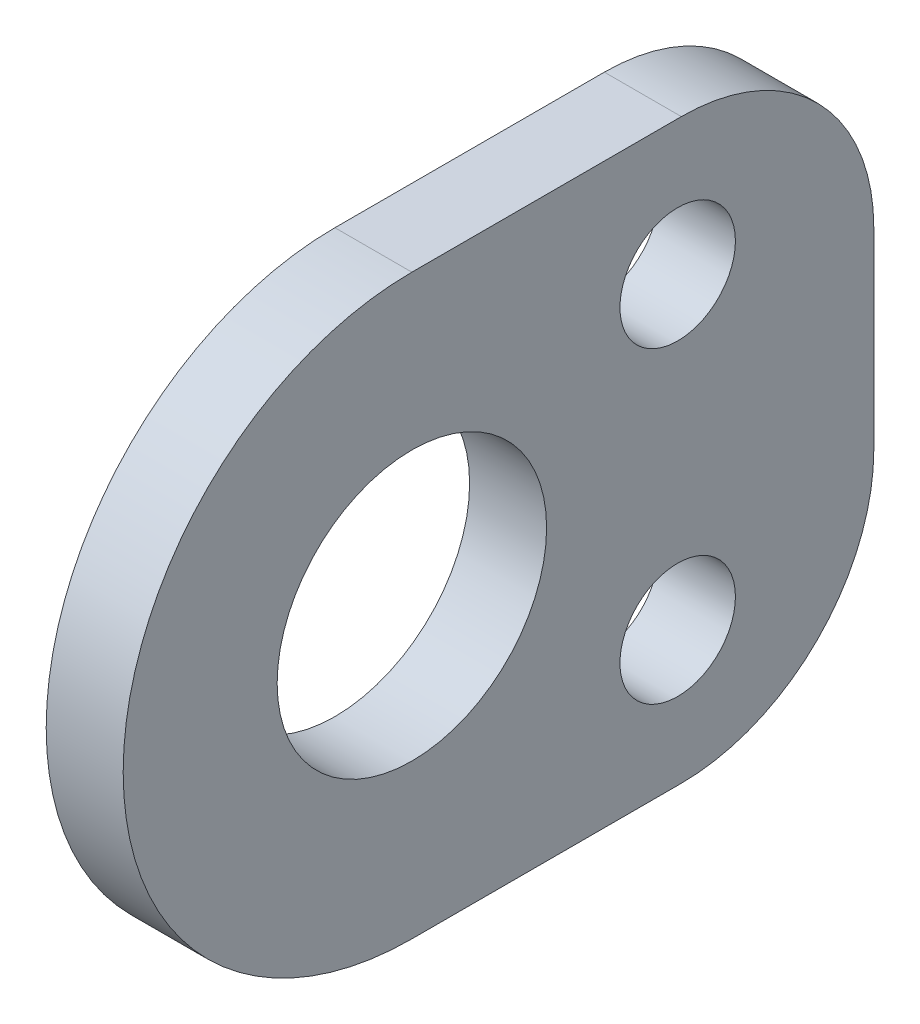
ISO-10303-21;
HEADER;
FILE_DESCRIPTION(('STEP AP214'),'2;1');
FILE_NAME('part.step','',(''),(''),'','','');
FILE_SCHEMA(('AUTOMOTIVE_DESIGN { 1 0 10303 214 1 1 1 1 }'));
ENDSEC;
DATA;
#1=APPLICATION_CONTEXT('core data for automotive mechanical design processes');
#2=APPLICATION_PROTOCOL_DEFINITION('international standard','automotive_design',2000,#1);
#3=PRODUCT_CONTEXT('',#1,'mechanical');
#4=PRODUCT('Part','Part','',(#3));
#5=PRODUCT_RELATED_PRODUCT_CATEGORY('part','',(#4));
#6=PRODUCT_DEFINITION_FORMATION('','',#4);
#7=PRODUCT_DEFINITION_CONTEXT('part definition',#1,'design');
#8=PRODUCT_DEFINITION('design','',#6,#7);
#9=PRODUCT_DEFINITION_SHAPE('','',#8);
#10=(LENGTH_UNIT() NAMED_UNIT(*) SI_UNIT(.MILLI.,.METRE.));
#11=(NAMED_UNIT(*) PLANE_ANGLE_UNIT() SI_UNIT($,.RADIAN.));
#12=(NAMED_UNIT(*) SI_UNIT($,.STERADIAN.) SOLID_ANGLE_UNIT());
#13=UNCERTAINTY_MEASURE_WITH_UNIT(LENGTH_MEASURE(1.E-05),#10,'distance_accuracy_value','');
#14=(GEOMETRIC_REPRESENTATION_CONTEXT(3) GLOBAL_UNCERTAINTY_ASSIGNED_CONTEXT((#13)) GLOBAL_UNIT_ASSIGNED_CONTEXT((#10,
#11,#12)) REPRESENTATION_CONTEXT('',''));
#15=CARTESIAN_POINT('',(0.,0.,0.));
#16=DIRECTION('',(0.,0.,1.));
#17=DIRECTION('',(1.,0.,0.));
#18=AXIS2_PLACEMENT_3D('',#15,#16,#17);
#19=CARTESIAN_POINT('',(2.,7.5,0.));
#20=DIRECTION('',(0.,1.,0.));
#21=DIRECTION('',(0.,0.,1.));
#22=AXIS2_PLACEMENT_3D('',#19,#20,#21);
#23=PLANE('',#22);
#24=DIRECTION('',(0.,0.,-1.));
#25=VECTOR('',#24,1.);
#26=CARTESIAN_POINT('',(2.,7.5,0.));
#27=LINE('',#26,#25);
#28=CARTESIAN_POINT('',(2.,7.5,0.));
#29=VERTEX_POINT('',#28);
#30=CARTESIAN_POINT('',(2.,7.5,-7.));
#31=VERTEX_POINT('',#30);
#32=EDGE_CURVE('E107',#29,#31,#27,.T.);
#33=ORIENTED_EDGE('',*,*,#32,.T.);
#34=DIRECTION('',(-1.,0.,0.));
#35=VECTOR('',#34,1.);
#36=CARTESIAN_POINT('',(2.,7.5,-7.));
#37=LINE('',#36,#35);
#38=CARTESIAN_POINT('',(0.,7.5,-7.));
#39=VERTEX_POINT('',#38);
#40=EDGE_CURVE('E11',#31,#39,#37,.T.);
#41=ORIENTED_EDGE('',*,*,#40,.T.);
#42=DIRECTION('',(0.,0.,-1.));
#43=VECTOR('',#42,1.);
#44=CARTESIAN_POINT('',(0.,7.5,0.));
#45=LINE('',#44,#43);
#46=CARTESIAN_POINT('',(0.,7.5,0.));
#47=VERTEX_POINT('',#46);
#48=EDGE_CURVE('E110',#47,#39,#45,.T.);
#49=ORIENTED_EDGE('',*,*,#48,.F.);
#50=DIRECTION('',(-1.,0.,0.));
#51=VECTOR('',#50,1.);
#52=CARTESIAN_POINT('',(2.,7.5,0.));
#53=LINE('',#52,#51);
#54=EDGE_CURVE('E105',#29,#47,#53,.T.);
#55=ORIENTED_EDGE('',*,*,#54,.F.);
#56=EDGE_LOOP('',(#33,#41,#49,#55));
#57=FACE_BOUND('',#56,.T.);
#58=ADVANCED_FACE('F49',(#57),#23,.T.);
#59=CARTESIAN_POINT('',(2.,0.,0.));
#60=DIRECTION('',(-1.,0.,0.));
#61=DIRECTION('',(0.,0.,1.));
#62=AXIS2_PLACEMENT_3D('',#59,#60,#61);
#63=CYLINDRICAL_SURFACE('',#62,7.5);
#64=CARTESIAN_POINT('',(0.,0.,0.));
#65=DIRECTION('',(1.,0.,0.));
#66=DIRECTION('',(0.,0.,-1.));
#67=AXIS2_PLACEMENT_3D('',#64,#65,#66);
#68=CIRCLE('',#67,7.5);
#69=CARTESIAN_POINT('',(0.,-7.5,0.));
#70=VERTEX_POINT('',#69);
#71=EDGE_CURVE('E156',#47,#70,#68,.T.);
#72=ORIENTED_EDGE('',*,*,#71,.T.);
#73=DIRECTION('',(-1.,0.,0.));
#74=VECTOR('',#73,1.);
#75=CARTESIAN_POINT('',(2.,-7.5,0.));
#76=LINE('',#75,#74);
#77=CARTESIAN_POINT('',(2.,-7.5,0.));
#78=VERTEX_POINT('',#77);
#79=EDGE_CURVE('E116',#78,#70,#76,.T.);
#80=ORIENTED_EDGE('',*,*,#79,.F.);
#81=CARTESIAN_POINT('',(2.,0.,0.));
#82=DIRECTION('',(1.,0.,0.));
#83=DIRECTION('',(0.,0.,-1.));
#84=AXIS2_PLACEMENT_3D('',#81,#82,#83);
#85=CIRCLE('',#84,7.5);
#86=EDGE_CURVE('E120',#29,#78,#85,.T.);
#87=ORIENTED_EDGE('',*,*,#86,.F.);
#88=ORIENTED_EDGE('',*,*,#54,.T.);
#89=EDGE_LOOP('',(#72,#80,#87,#88));
#90=FACE_BOUND('',#89,.T.);
#91=ADVANCED_FACE('F121',(#90),#63,.T.);
#92=CARTESIAN_POINT('',(2.,-7.5,0.));
#93=DIRECTION('',(0.,-1.,0.));
#94=DIRECTION('',(0.,0.,-1.));
#95=AXIS2_PLACEMENT_3D('',#92,#93,#94);
#96=PLANE('',#95);
#97=DIRECTION('',(0.,0.,1.));
#98=VECTOR('',#97,1.);
#99=CARTESIAN_POINT('',(0.,-7.5,0.));
#100=LINE('',#99,#98);
#101=CARTESIAN_POINT('',(0.,-7.5,-7.));
#102=VERTEX_POINT('',#101);
#103=EDGE_CURVE('E159',#102,#70,#100,.T.);
#104=ORIENTED_EDGE('',*,*,#103,.F.);
#105=DIRECTION('',(-1.,0.,0.));
#106=VECTOR('',#105,1.);
#107=CARTESIAN_POINT('',(2.,-7.5,-7.));
#108=LINE('',#107,#106);
#109=CARTESIAN_POINT('',(2.,-7.5,-7.));
#110=VERTEX_POINT('',#109);
#111=EDGE_CURVE('E73',#102,#110,#108,.F.);
#112=ORIENTED_EDGE('',*,*,#111,.T.);
#113=DIRECTION('',(0.,0.,1.));
#114=VECTOR('',#113,1.);
#115=CARTESIAN_POINT('',(2.,-7.5,0.));
#116=LINE('',#115,#114);
#117=EDGE_CURVE('E124',#110,#78,#116,.T.);
#118=ORIENTED_EDGE('',*,*,#117,.T.);
#119=ORIENTED_EDGE('',*,*,#79,.T.);
#120=EDGE_LOOP('',(#104,#112,#118,#119));
#121=FACE_BOUND('',#120,.T.);
#122=ADVANCED_FACE('F195',(#121),#96,.T.);
#123=CARTESIAN_POINT('',(2.,0.,0.));
#124=DIRECTION('',(-1.,0.,0.));
#125=DIRECTION('',(0.,0.,1.));
#126=AXIS2_PLACEMENT_3D('',#123,#124,#125);
#127=CYLINDRICAL_SURFACE('',#126,3.5);
#128=CARTESIAN_POINT('',(2.,0.,0.));
#129=DIRECTION('',(1.,0.,0.));
#130=DIRECTION('',(0.,0.,-1.));
#131=AXIS2_PLACEMENT_3D('',#128,#129,#130);
#132=CIRCLE('',#131,3.5);
#133=CARTESIAN_POINT('',(2.,0.,-3.5));
#134=VERTEX_POINT('',#133);
#135=EDGE_CURVE('E128',#134,#134,#132,.T.);
#136=ORIENTED_EDGE('',*,*,#135,.T.);
#137=EDGE_LOOP('',(#136));
#138=FACE_BOUND('',#137,.T.);
#139=CARTESIAN_POINT('',(0.,0.,0.));
#140=DIRECTION('',(1.,0.,0.));
#141=DIRECTION('',(0.,0.,-1.));
#142=AXIS2_PLACEMENT_3D('',#139,#140,#141);
#143=CIRCLE('',#142,3.5);
#144=CARTESIAN_POINT('',(0.,0.,-3.5));
#145=VERTEX_POINT('',#144);
#146=EDGE_CURVE('E150',#145,#145,#143,.T.);
#147=ORIENTED_EDGE('',*,*,#146,.F.);
#148=EDGE_LOOP('',(#147));
#149=FACE_BOUND('',#148,.T.);
#150=ADVANCED_FACE('F211',(#138,#149),#127,.F.);
#151=CARTESIAN_POINT('',(2.,4.,-6.9050995648144));
#152=DIRECTION('',(-1.,0.,0.));
#153=DIRECTION('',(0.,0.,1.));
#154=AXIS2_PLACEMENT_3D('',#151,#152,#153);
#155=CYLINDRICAL_SURFACE('',#154,1.5);
#156=CARTESIAN_POINT('',(2.,4.,-6.9050995648144));
#157=DIRECTION('',(1.,0.,0.));
#158=DIRECTION('',(0.,0.,-1.));
#159=AXIS2_PLACEMENT_3D('',#156,#157,#158);
#160=CIRCLE('',#159,1.5);
#161=CARTESIAN_POINT('',(2.,4.,-8.4050995648144));
#162=VERTEX_POINT('',#161);
#163=EDGE_CURVE('E132',#162,#162,#160,.T.);
#164=ORIENTED_EDGE('',*,*,#163,.T.);
#165=EDGE_LOOP('',(#164));
#166=FACE_BOUND('',#165,.T.);
#167=CARTESIAN_POINT('',(0.,4.,-6.9050995648144));
#168=DIRECTION('',(1.,0.,0.));
#169=DIRECTION('',(0.,0.,-1.));
#170=AXIS2_PLACEMENT_3D('',#167,#168,#169);
#171=CIRCLE('',#170,1.5);
#172=CARTESIAN_POINT('',(0.,4.,-8.4050995648144));
#173=VERTEX_POINT('',#172);
#174=EDGE_CURVE('E146',#173,#173,#171,.T.);
#175=ORIENTED_EDGE('',*,*,#174,.F.);
#176=EDGE_LOOP('',(#175));
#177=FACE_BOUND('',#176,.T.);
#178=ADVANCED_FACE('F214',(#166,#177),#155,.F.);
#179=CARTESIAN_POINT('',(2.,-4.,-6.9050995648144));
#180=DIRECTION('',(-1.,0.,0.));
#181=DIRECTION('',(0.,0.,1.));
#182=AXIS2_PLACEMENT_3D('',#179,#180,#181);
#183=CYLINDRICAL_SURFACE('',#182,1.5);
#184=CARTESIAN_POINT('',(2.,-4.,-6.9050995648144));
#185=DIRECTION('',(1.,0.,0.));
#186=DIRECTION('',(0.,0.,-1.));
#187=AXIS2_PLACEMENT_3D('',#184,#185,#186);
#188=CIRCLE('',#187,1.5);
#189=CARTESIAN_POINT('',(2.,-4.,-8.4050995648144));
#190=VERTEX_POINT('',#189);
#191=EDGE_CURVE('E166',#190,#190,#188,.T.);
#192=ORIENTED_EDGE('',*,*,#191,.T.);
#193=EDGE_LOOP('',(#192));
#194=FACE_BOUND('',#193,.T.);
#195=CARTESIAN_POINT('',(0.,-4.,-6.9050995648144));
#196=DIRECTION('',(1.,0.,0.));
#197=DIRECTION('',(0.,0.,-1.));
#198=AXIS2_PLACEMENT_3D('',#195,#196,#197);
#199=CIRCLE('',#198,1.5);
#200=CARTESIAN_POINT('',(0.,-4.,-8.4050995648144));
#201=VERTEX_POINT('',#200);
#202=EDGE_CURVE('E142',#201,#201,#199,.T.);
#203=ORIENTED_EDGE('',*,*,#202,.F.);
#204=EDGE_LOOP('',(#203));
#205=FACE_BOUND('',#204,.T.);
#206=ADVANCED_FACE('F218',(#194,#205),#183,.F.);
#207=CARTESIAN_POINT('',(2.,0.,-12.));
#208=DIRECTION('',(0.,0.,-1.));
#209=DIRECTION('',(-1.,0.,0.));
#210=AXIS2_PLACEMENT_3D('',#207,#208,#209);
#211=PLANE('',#210);
#212=DIRECTION('',(0.,-1.,0.));
#213=VECTOR('',#212,1.);
#214=CARTESIAN_POINT('',(2.,0.,-12.));
#215=LINE('',#214,#213);
#216=CARTESIAN_POINT('',(2.,2.5,-12.));
#217=VERTEX_POINT('',#216);
#218=CARTESIAN_POINT('',(2.,-2.5,-12.));
#219=VERTEX_POINT('',#218);
#220=EDGE_CURVE('E138',#217,#219,#215,.T.);
#221=ORIENTED_EDGE('',*,*,#220,.T.);
#222=DIRECTION('',(-1.,0.,0.));
#223=VECTOR('',#222,1.);
#224=CARTESIAN_POINT('',(2.,-2.5,-12.));
#225=LINE('',#224,#223);
#226=CARTESIAN_POINT('',(0.,-2.5,-12.));
#227=VERTEX_POINT('',#226);
#228=EDGE_CURVE('E171',#219,#227,#225,.T.);
#229=ORIENTED_EDGE('',*,*,#228,.T.);
#230=DIRECTION('',(0.,-1.,0.));
#231=VECTOR('',#230,1.);
#232=CARTESIAN_POINT('',(0.,0.,-12.));
#233=LINE('',#232,#231);
#234=CARTESIAN_POINT('',(0.,2.5,-12.));
#235=VERTEX_POINT('',#234);
#236=EDGE_CURVE('E162',#235,#227,#233,.T.);
#237=ORIENTED_EDGE('',*,*,#236,.F.);
#238=DIRECTION('',(-1.,0.,0.));
#239=VECTOR('',#238,1.);
#240=CARTESIAN_POINT('',(2.,2.5,-12.));
#241=LINE('',#240,#239);
#242=EDGE_CURVE('E115',#235,#217,#241,.F.);
#243=ORIENTED_EDGE('',*,*,#242,.T.);
#244=EDGE_LOOP('',(#221,#229,#237,#243));
#245=FACE_BOUND('',#244,.T.);
#246=ADVANCED_FACE('F189',(#245),#211,.T.);
#247=CARTESIAN_POINT('',(2.,0.,0.));
#248=DIRECTION('',(1.,0.,0.));
#249=DIRECTION('',(0.,0.,-1.));
#250=AXIS2_PLACEMENT_3D('',#247,#248,#249);
#251=PLANE('',#250);
#252=ORIENTED_EDGE('',*,*,#191,.F.);
#253=EDGE_LOOP('',(#252));
#254=FACE_BOUND('',#253,.T.);
#255=ORIENTED_EDGE('',*,*,#163,.F.);
#256=EDGE_LOOP('',(#255));
#257=FACE_BOUND('',#256,.T.);
#258=ORIENTED_EDGE('',*,*,#135,.F.);
#259=EDGE_LOOP('',(#258));
#260=FACE_BOUND('',#259,.T.);
#261=ORIENTED_EDGE('',*,*,#117,.F.);
#262=CARTESIAN_POINT('',(2.,-2.5,-7.));
#263=DIRECTION('',(1.,0.,0.));
#264=DIRECTION('',(0.,0.,-1.));
#265=AXIS2_PLACEMENT_3D('',#262,#263,#264);
#266=CIRCLE('',#265,5.);
#267=EDGE_CURVE('E58',#110,#219,#266,.T.);
#268=ORIENTED_EDGE('',*,*,#267,.T.);
#269=ORIENTED_EDGE('',*,*,#220,.F.);
#270=CARTESIAN_POINT('',(2.,2.5,-7.));
#271=DIRECTION('',(1.,0.,0.));
#272=DIRECTION('',(0.,0.,-1.));
#273=AXIS2_PLACEMENT_3D('',#270,#271,#272);
#274=CIRCLE('',#273,5.);
#275=EDGE_CURVE('E65',#217,#31,#274,.T.);
#276=ORIENTED_EDGE('',*,*,#275,.T.);
#277=ORIENTED_EDGE('',*,*,#32,.F.);
#278=ORIENTED_EDGE('',*,*,#86,.T.);
#279=EDGE_LOOP('',(#261,#268,#269,#276,#277,#278));
#280=FACE_BOUND('',#279,.T.);
#281=ADVANCED_FACE('F126',(#254,#257,#260,#280),#251,.T.);
#282=CARTESIAN_POINT('',(0.,0.,0.));
#283=DIRECTION('',(1.,0.,0.));
#284=DIRECTION('',(0.,0.,-1.));
#285=AXIS2_PLACEMENT_3D('',#282,#283,#284);
#286=PLANE('',#285);
#287=ORIENTED_EDGE('',*,*,#202,.T.);
#288=EDGE_LOOP('',(#287));
#289=FACE_BOUND('',#288,.T.);
#290=ORIENTED_EDGE('',*,*,#174,.T.);
#291=EDGE_LOOP('',(#290));
#292=FACE_BOUND('',#291,.T.);
#293=ORIENTED_EDGE('',*,*,#146,.T.);
#294=EDGE_LOOP('',(#293));
#295=FACE_BOUND('',#294,.T.);
#296=ORIENTED_EDGE('',*,*,#236,.T.);
#297=CARTESIAN_POINT('',(0.,-2.5,-7.));
#298=DIRECTION('',(1.,0.,0.));
#299=DIRECTION('',(0.,0.,-1.));
#300=AXIS2_PLACEMENT_3D('',#297,#298,#299);
#301=CIRCLE('',#300,5.);
#302=EDGE_CURVE('E178',#227,#102,#301,.F.);
#303=ORIENTED_EDGE('',*,*,#302,.T.);
#304=ORIENTED_EDGE('',*,*,#103,.T.);
#305=ORIENTED_EDGE('',*,*,#71,.F.);
#306=ORIENTED_EDGE('',*,*,#48,.T.);
#307=CARTESIAN_POINT('',(0.,2.5,-7.));
#308=DIRECTION('',(1.,0.,0.));
#309=DIRECTION('',(0.,0.,-1.));
#310=AXIS2_PLACEMENT_3D('',#307,#308,#309);
#311=CIRCLE('',#310,5.);
#312=EDGE_CURVE('E175',#39,#235,#311,.F.);
#313=ORIENTED_EDGE('',*,*,#312,.T.);
#314=EDGE_LOOP('',(#296,#303,#304,#305,#306,#313));
#315=FACE_BOUND('',#314,.T.);
#316=ADVANCED_FACE('F194',(#289,#292,#295,#315),#286,.F.);
#317=CARTESIAN_POINT('',(2.,-2.5,-7.));
#318=DIRECTION('',(-1.,0.,0.));
#319=DIRECTION('',(0.,0.,1.));
#320=AXIS2_PLACEMENT_3D('',#317,#318,#319);
#321=CYLINDRICAL_SURFACE('',#320,5.);
#322=ORIENTED_EDGE('',*,*,#267,.F.);
#323=ORIENTED_EDGE('',*,*,#111,.F.);
#324=ORIENTED_EDGE('',*,*,#302,.F.);
#325=ORIENTED_EDGE('',*,*,#228,.F.);
#326=EDGE_LOOP('',(#322,#323,#324,#325));
#327=FACE_BOUND('',#326,.T.);
#328=ADVANCED_FACE('F192',(#327),#321,.T.);
#329=CARTESIAN_POINT('',(2.,2.5,-7.));
#330=DIRECTION('',(-1.,0.,0.));
#331=DIRECTION('',(0.,0.,1.));
#332=AXIS2_PLACEMENT_3D('',#329,#330,#331);
#333=CYLINDRICAL_SURFACE('',#332,5.);
#334=ORIENTED_EDGE('',*,*,#275,.F.);
#335=ORIENTED_EDGE('',*,*,#242,.F.);
#336=ORIENTED_EDGE('',*,*,#312,.F.);
#337=ORIENTED_EDGE('',*,*,#40,.F.);
#338=EDGE_LOOP('',(#334,#335,#336,#337));
#339=FACE_BOUND('',#338,.T.);
#340=ADVANCED_FACE('F51',(#339),#333,.T.);
#341=CLOSED_SHELL('',(#58,#91,#122,#150,#178,#206,#246,#281,#316,#328,#340));
#342=MANIFOLD_SOLID_BREP('B2',#341);
#343=ADVANCED_BREP_SHAPE_REPRESENTATION('',(#18,#342),#14);
#344=SHAPE_DEFINITION_REPRESENTATION(#9,#343);
ENDSEC;
END-ISO-10303-21;
